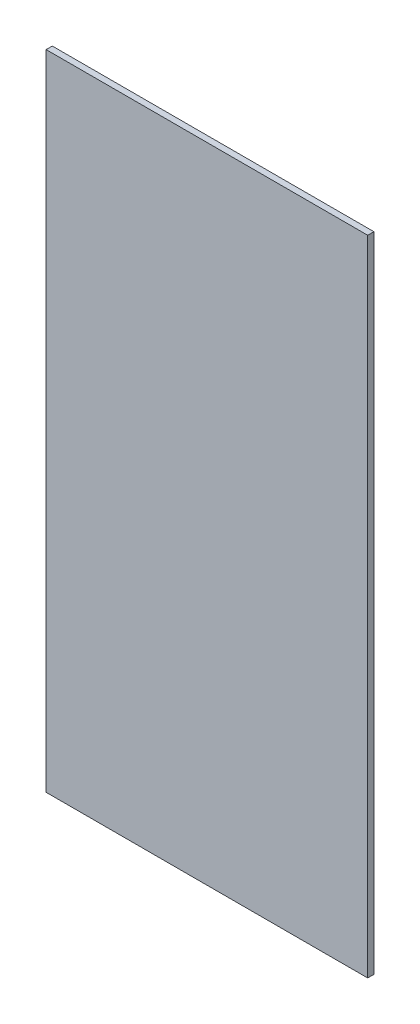
ISO-10303-21;
HEADER;
FILE_DESCRIPTION(('STEP AP214'),'2;1');
FILE_NAME('part.step','',(''),(''),'','','');
FILE_SCHEMA(('AUTOMOTIVE_DESIGN { 1 0 10303 214 1 1 1 1 }'));
ENDSEC;
DATA;
#1=APPLICATION_CONTEXT('core data for automotive mechanical design processes');
#2=APPLICATION_PROTOCOL_DEFINITION('international standard','automotive_design',2000,#1);
#3=PRODUCT_CONTEXT('',#1,'mechanical');
#4=PRODUCT('Part','Part','',(#3));
#5=PRODUCT_RELATED_PRODUCT_CATEGORY('part','',(#4));
#6=PRODUCT_DEFINITION_FORMATION('','',#4);
#7=PRODUCT_DEFINITION_CONTEXT('part definition',#1,'design');
#8=PRODUCT_DEFINITION('design','',#6,#7);
#9=PRODUCT_DEFINITION_SHAPE('','',#8);
#10=(LENGTH_UNIT() NAMED_UNIT(*) SI_UNIT(.MILLI.,.METRE.));
#11=(NAMED_UNIT(*) PLANE_ANGLE_UNIT() SI_UNIT($,.RADIAN.));
#12=(NAMED_UNIT(*) SI_UNIT($,.STERADIAN.) SOLID_ANGLE_UNIT());
#13=UNCERTAINTY_MEASURE_WITH_UNIT(LENGTH_MEASURE(1.E-05),#10,'distance_accuracy_value','');
#14=(GEOMETRIC_REPRESENTATION_CONTEXT(3) GLOBAL_UNCERTAINTY_ASSIGNED_CONTEXT((#13)) GLOBAL_UNIT_ASSIGNED_CONTEXT((#10,
#11,#12)) REPRESENTATION_CONTEXT('',''));
#15=CARTESIAN_POINT('',(0.,0.,0.));
#16=DIRECTION('',(0.,0.,1.));
#17=DIRECTION('',(1.,0.,0.));
#18=AXIS2_PLACEMENT_3D('',#15,#16,#17);
#19=CARTESIAN_POINT('',(-82.5500000000001,165.1,3.175));
#20=DIRECTION('',(1.,0.,0.));
#21=DIRECTION('',(0.,1.,0.));
#22=AXIS2_PLACEMENT_3D('',#19,#20,#21);
#23=PLANE('',#22);
#24=DIRECTION('',(0.,-1.,0.));
#25=VECTOR('',#24,1.);
#26=CARTESIAN_POINT('',(-82.5500000000001,165.1,0.));
#27=LINE('',#26,#25);
#28=CARTESIAN_POINT('',(-82.5500000000001,165.1,0.));
#29=VERTEX_POINT('',#28);
#30=CARTESIAN_POINT('',(-82.55,-165.1,0.));
#31=VERTEX_POINT('',#30);
#32=EDGE_CURVE('E96',#29,#31,#27,.T.);
#33=ORIENTED_EDGE('',*,*,#32,.T.);
#34=DIRECTION('',(0.,0.,-1.));
#35=VECTOR('',#34,1.);
#36=CARTESIAN_POINT('',(-82.55,-165.1,3.175));
#37=LINE('',#36,#35);
#38=CARTESIAN_POINT('',(-82.55,-165.1,3.175));
#39=VERTEX_POINT('',#38);
#40=EDGE_CURVE('E11',#39,#31,#37,.T.);
#41=ORIENTED_EDGE('',*,*,#40,.F.);
#42=DIRECTION('',(0.,-1.,0.));
#43=VECTOR('',#42,1.);
#44=CARTESIAN_POINT('',(-82.5500000000001,165.1,3.175));
#45=LINE('',#44,#43);
#46=CARTESIAN_POINT('',(-82.5500000000001,165.1,3.175));
#47=VERTEX_POINT('',#46);
#48=EDGE_CURVE('E84',#47,#39,#45,.T.);
#49=ORIENTED_EDGE('',*,*,#48,.F.);
#50=DIRECTION('',(0.,0.,-1.));
#51=VECTOR('',#50,1.);
#52=CARTESIAN_POINT('',(-82.5500000000001,165.1,3.175));
#53=LINE('',#52,#51);
#54=EDGE_CURVE('E92',#47,#29,#53,.T.);
#55=ORIENTED_EDGE('',*,*,#54,.T.);
#56=EDGE_LOOP('',(#33,#41,#49,#55));
#57=FACE_BOUND('',#56,.T.);
#58=ADVANCED_FACE('F33',(#57),#23,.F.);
#59=CARTESIAN_POINT('',(-82.55,-165.1,3.175));
#60=DIRECTION('',(0.,1.,0.));
#61=DIRECTION('',(-1.,0.,0.));
#62=AXIS2_PLACEMENT_3D('',#59,#60,#61);
#63=PLANE('',#62);
#64=DIRECTION('',(1.,0.,0.));
#65=VECTOR('',#64,1.);
#66=CARTESIAN_POINT('',(-82.55,-165.1,0.));
#67=LINE('',#66,#65);
#68=CARTESIAN_POINT('',(82.55,-165.1,0.));
#69=VERTEX_POINT('',#68);
#70=EDGE_CURVE('E88',#31,#69,#67,.T.);
#71=ORIENTED_EDGE('',*,*,#70,.T.);
#72=DIRECTION('',(0.,0.,-1.));
#73=VECTOR('',#72,1.);
#74=CARTESIAN_POINT('',(82.55,-165.1,3.175));
#75=LINE('',#74,#73);
#76=CARTESIAN_POINT('',(82.55,-165.1,3.175));
#77=VERTEX_POINT('',#76);
#78=EDGE_CURVE('E41',#77,#69,#75,.T.);
#79=ORIENTED_EDGE('',*,*,#78,.F.);
#80=DIRECTION('',(1.,0.,0.));
#81=VECTOR('',#80,1.);
#82=CARTESIAN_POINT('',(-82.55,-165.1,3.175));
#83=LINE('',#82,#81);
#84=EDGE_CURVE('E79',#39,#77,#83,.T.);
#85=ORIENTED_EDGE('',*,*,#84,.F.);
#86=ORIENTED_EDGE('',*,*,#40,.T.);
#87=EDGE_LOOP('',(#71,#79,#85,#86));
#88=FACE_BOUND('',#87,.T.);
#89=ADVANCED_FACE('F87',(#88),#63,.F.);
#90=CARTESIAN_POINT('',(82.5499999999999,165.1,3.175));
#91=DIRECTION('',(-1.,0.,0.));
#92=DIRECTION('',(0.,-1.,0.));
#93=AXIS2_PLACEMENT_3D('',#90,#91,#92);
#94=PLANE('',#93);
#95=DIRECTION('',(0.,1.,0.));
#96=VECTOR('',#95,1.);
#97=CARTESIAN_POINT('',(82.5499999999999,165.1,0.));
#98=LINE('',#97,#96);
#99=CARTESIAN_POINT('',(82.5499999999999,165.1,0.));
#100=VERTEX_POINT('',#99);
#101=EDGE_CURVE('E66',#69,#100,#98,.T.);
#102=ORIENTED_EDGE('',*,*,#101,.T.);
#103=DIRECTION('',(0.,0.,-1.));
#104=VECTOR('',#103,1.);
#105=CARTESIAN_POINT('',(82.5499999999999,165.1,3.175));
#106=LINE('',#105,#104);
#107=CARTESIAN_POINT('',(82.5499999999999,165.1,3.175));
#108=VERTEX_POINT('',#107);
#109=EDGE_CURVE('E89',#108,#100,#106,.T.);
#110=ORIENTED_EDGE('',*,*,#109,.F.);
#111=DIRECTION('',(0.,1.,0.));
#112=VECTOR('',#111,1.);
#113=CARTESIAN_POINT('',(82.5499999999999,165.1,3.175));
#114=LINE('',#113,#112);
#115=EDGE_CURVE('E82',#77,#108,#114,.T.);
#116=ORIENTED_EDGE('',*,*,#115,.F.);
#117=ORIENTED_EDGE('',*,*,#78,.T.);
#118=EDGE_LOOP('',(#102,#110,#116,#117));
#119=FACE_BOUND('',#118,.T.);
#120=ADVANCED_FACE('F90',(#119),#94,.F.);
#121=CARTESIAN_POINT('',(-82.5500000000001,165.1,3.175));
#122=DIRECTION('',(0.,-1.,0.));
#123=DIRECTION('',(1.,0.,0.));
#124=AXIS2_PLACEMENT_3D('',#121,#122,#123);
#125=PLANE('',#124);
#126=DIRECTION('',(-1.,0.,0.));
#127=VECTOR('',#126,1.);
#128=CARTESIAN_POINT('',(-82.5500000000001,165.1,0.));
#129=LINE('',#128,#127);
#130=EDGE_CURVE('E72',#100,#29,#129,.T.);
#131=ORIENTED_EDGE('',*,*,#130,.T.);
#132=ORIENTED_EDGE('',*,*,#54,.F.);
#133=DIRECTION('',(-1.,0.,0.));
#134=VECTOR('',#133,1.);
#135=CARTESIAN_POINT('',(-82.5500000000001,165.1,3.175));
#136=LINE('',#135,#134);
#137=EDGE_CURVE('E49',#108,#47,#136,.T.);
#138=ORIENTED_EDGE('',*,*,#137,.F.);
#139=ORIENTED_EDGE('',*,*,#109,.T.);
#140=EDGE_LOOP('',(#131,#132,#138,#139));
#141=FACE_BOUND('',#140,.T.);
#142=ADVANCED_FACE('F103',(#141),#125,.F.);
#143=CARTESIAN_POINT('',(0.,0.,3.175));
#144=DIRECTION('',(0.,0.,1.));
#145=DIRECTION('',(1.,0.,0.));
#146=AXIS2_PLACEMENT_3D('',#143,#144,#145);
#147=PLANE('',#146);
#148=ORIENTED_EDGE('',*,*,#48,.T.);
#149=ORIENTED_EDGE('',*,*,#84,.T.);
#150=ORIENTED_EDGE('',*,*,#115,.T.);
#151=ORIENTED_EDGE('',*,*,#137,.T.);
#152=EDGE_LOOP('',(#148,#149,#150,#151));
#153=FACE_BOUND('',#152,.T.);
#154=ADVANCED_FACE('F80',(#153),#147,.T.);
#155=CARTESIAN_POINT('',(0.,0.,0.));
#156=DIRECTION('',(0.,0.,1.));
#157=DIRECTION('',(1.,0.,0.));
#158=AXIS2_PLACEMENT_3D('',#155,#156,#157);
#159=PLANE('',#158);
#160=ORIENTED_EDGE('',*,*,#32,.F.);
#161=ORIENTED_EDGE('',*,*,#130,.F.);
#162=ORIENTED_EDGE('',*,*,#101,.F.);
#163=ORIENTED_EDGE('',*,*,#70,.F.);
#164=EDGE_LOOP('',(#160,#161,#162,#163));
#165=FACE_BOUND('',#164,.T.);
#166=ADVANCED_FACE('F106',(#165),#159,.F.);
#167=CLOSED_SHELL('',(#58,#89,#120,#142,#154,#166));
#168=MANIFOLD_SOLID_BREP('B2',#167);
#169=ADVANCED_BREP_SHAPE_REPRESENTATION('',(#18,#168),#14);
#170=SHAPE_DEFINITION_REPRESENTATION(#9,#169);
ENDSEC;
END-ISO-10303-21;
